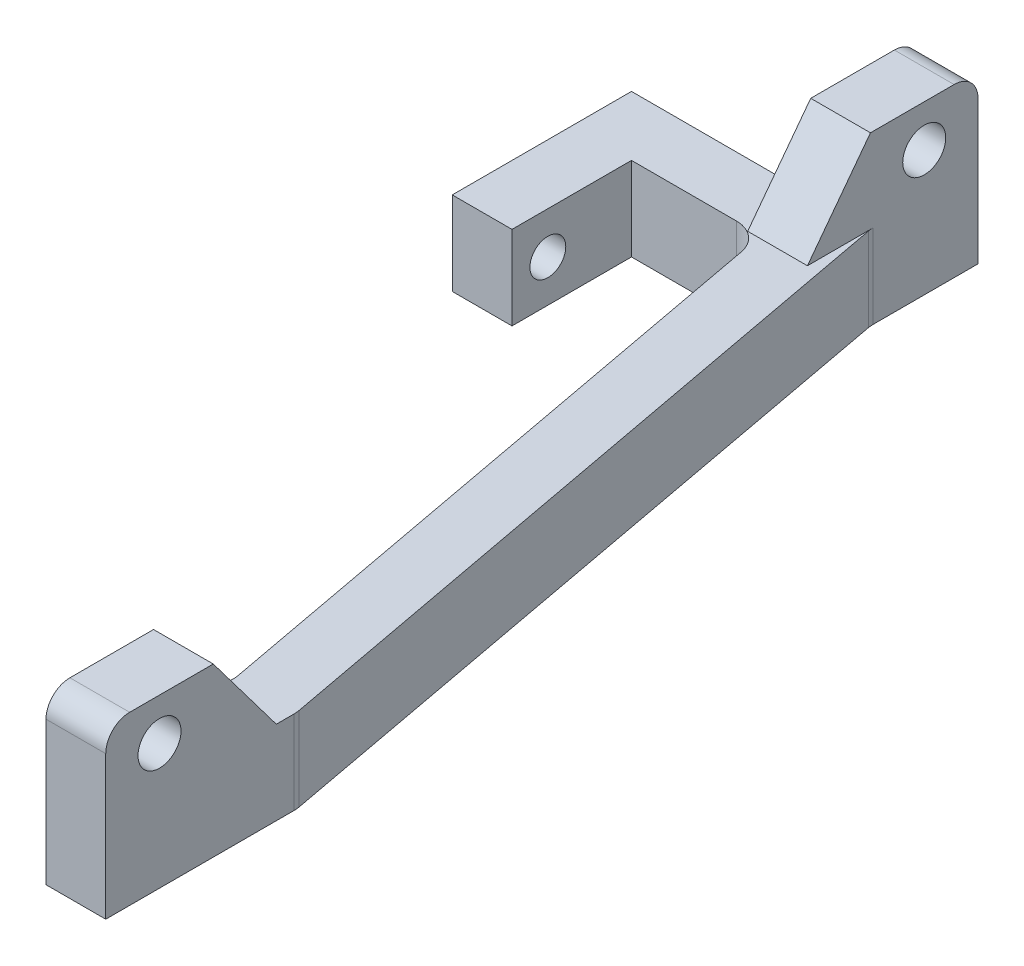
ISO-10303-21;
HEADER;
FILE_DESCRIPTION(('STEP AP214'),'2;1');
FILE_NAME('part.step','',(''),(''),'','','');
FILE_SCHEMA(('AUTOMOTIVE_DESIGN { 1 0 10303 214 1 1 1 1 }'));
ENDSEC;
DATA;
#1=APPLICATION_CONTEXT('core data for automotive mechanical design processes');
#2=APPLICATION_PROTOCOL_DEFINITION('international standard','automotive_design',2000,#1);
#3=PRODUCT_CONTEXT('',#1,'mechanical');
#4=PRODUCT('Part','Part','',(#3));
#5=PRODUCT_RELATED_PRODUCT_CATEGORY('part','',(#4));
#6=PRODUCT_DEFINITION_FORMATION('','',#4);
#7=PRODUCT_DEFINITION_CONTEXT('part definition',#1,'design');
#8=PRODUCT_DEFINITION('design','',#6,#7);
#9=PRODUCT_DEFINITION_SHAPE('','',#8);
#10=(LENGTH_UNIT() NAMED_UNIT(*) SI_UNIT(.MILLI.,.METRE.));
#11=(NAMED_UNIT(*) PLANE_ANGLE_UNIT() SI_UNIT($,.RADIAN.));
#12=(NAMED_UNIT(*) SI_UNIT($,.STERADIAN.) SOLID_ANGLE_UNIT());
#13=UNCERTAINTY_MEASURE_WITH_UNIT(LENGTH_MEASURE(1.E-05),#10,'distance_accuracy_value','');
#14=(GEOMETRIC_REPRESENTATION_CONTEXT(3) GLOBAL_UNCERTAINTY_ASSIGNED_CONTEXT((#13)) GLOBAL_UNIT_ASSIGNED_CONTEXT((#10,
#11,#12)) REPRESENTATION_CONTEXT('',''));
#15=CARTESIAN_POINT('',(0.,0.,0.));
#16=DIRECTION('',(0.,0.,1.));
#17=DIRECTION('',(1.,0.,0.));
#18=AXIS2_PLACEMENT_3D('',#15,#16,#17);
#19=CARTESIAN_POINT('',(0.,7.,0.));
#20=DIRECTION('',(0.,1.,0.));
#21=DIRECTION('',(0.,0.,1.));
#22=AXIS2_PLACEMENT_3D('',#19,#20,#21);
#23=PLANE('',#22);
#24=DIRECTION('',(0.,0.,-1.));
#25=VECTOR('',#24,1.);
#26=CARTESIAN_POINT('',(23.4138420040259,7.,0.));
#27=LINE('',#26,#25);
#28=CARTESIAN_POINT('',(23.4138420040259,7.,-5.27487835071954));
#29=VERTEX_POINT('',#28);
#30=CARTESIAN_POINT('',(23.4138420040259,7.,-6.76893991988756));
#31=VERTEX_POINT('',#30);
#32=EDGE_CURVE('E399',#29,#31,#27,.T.);
#33=ORIENTED_EDGE('',*,*,#32,.F.);
#34=DIRECTION('',(1.,0.,0.));
#35=VECTOR('',#34,1.);
#36=CARTESIAN_POINT('',(0.,7.,-5.27487835071958));
#37=LINE('',#36,#35);
#38=CARTESIAN_POINT('',(28.5,7.,-5.27487835071953));
#39=VERTEX_POINT('',#38);
#40=EDGE_CURVE('E362',#29,#39,#37,.T.);
#41=ORIENTED_EDGE('',*,*,#40,.T.);
#42=DIRECTION('',(0.,0.,-1.));
#43=VECTOR('',#42,1.);
#44=CARTESIAN_POINT('',(28.5,7.,0.));
#45=LINE('',#44,#43);
#46=CARTESIAN_POINT('',(28.5,7.,-6.76893991988754));
#47=VERTEX_POINT('',#46);
#48=EDGE_CURVE('E241',#39,#47,#45,.T.);
#49=ORIENTED_EDGE('',*,*,#48,.T.);
#50=CARTESIAN_POINT('',(26.,7.,-6.76893991988754));
#51=DIRECTION('',(0.,1.,0.));
#52=DIRECTION('',(0.,0.,1.));
#53=AXIS2_PLACEMENT_3D('',#50,#51,#52);
#54=CIRCLE('',#53,2.5);
#55=CARTESIAN_POINT('',(28.4576507473606,7.,-7.22714599142935));
#56=VERTEX_POINT('',#55);
#57=EDGE_CURVE('E308',#47,#56,#54,.T.);
#58=ORIENTED_EDGE('',*,*,#57,.T.);
#59=DIRECTION('',(-0.183282428616724,0.,-0.983060298944249));
#60=VECTOR('',#59,1.);
#61=CARTESIAN_POINT('',(28.8038589672404,7.,-5.37021099389228));
#62=LINE('',#61,#60);
#63=CARTESIAN_POINT('',(17.5423492526394,7.,-65.7728540085706));
#64=VERTEX_POINT('',#63);
#65=EDGE_CURVE('E236',#56,#64,#62,.T.);
#66=ORIENTED_EDGE('',*,*,#65,.T.);
#67=CARTESIAN_POINT('',(20.,7.,-66.2310600801124));
#68=DIRECTION('',(0.,1.,0.));
#69=DIRECTION('',(0.,0.,1.));
#70=AXIS2_PLACEMENT_3D('',#67,#68,#69);
#71=CIRCLE('',#70,2.5);
#72=CARTESIAN_POINT('',(17.5,7.,-66.2310600801124));
#73=VERTEX_POINT('',#72);
#74=EDGE_CURVE('E326',#64,#73,#71,.F.);
#75=ORIENTED_EDGE('',*,*,#74,.T.);
#76=DIRECTION('',(0.,0.,-1.));
#77=VECTOR('',#76,1.);
#78=CARTESIAN_POINT('',(17.5,7.,0.));
#79=LINE('',#78,#77);
#80=CARTESIAN_POINT('',(17.5,7.,-60.7251216492804));
#81=VERTEX_POINT('',#80);
#82=EDGE_CURVE('E290',#81,#73,#79,.T.);
#83=ORIENTED_EDGE('',*,*,#82,.F.);
#84=DIRECTION('',(-1.,0.,0.));
#85=VECTOR('',#84,1.);
#86=CARTESIAN_POINT('',(12.5,7.,-60.7251216492804));
#87=LINE('',#86,#85);
#88=CARTESIAN_POINT('',(12.5,7.,-60.7251216492804));
#89=VERTEX_POINT('',#88);
#90=EDGE_CURVE('E359',#81,#89,#87,.T.);
#91=ORIENTED_EDGE('',*,*,#90,.T.);
#92=DIRECTION('',(0.,0.,-1.));
#93=VECTOR('',#92,1.);
#94=CARTESIAN_POINT('',(12.5000000000001,7.,0.));
#95=LINE('',#94,#93);
#96=CARTESIAN_POINT('',(12.5,7.,-66.));
#97=VERTEX_POINT('',#96);
#98=EDGE_CURVE('E234',#89,#97,#95,.T.);
#99=ORIENTED_EDGE('',*,*,#98,.T.);
#100=DIRECTION('',(1.,0.,0.));
#101=VECTOR('',#100,1.);
#102=CARTESIAN_POINT('',(1.83186799063151E-13,7.,-66.));
#103=LINE('',#102,#101);
#104=CARTESIAN_POINT('',(-2.5,7.,-66.));
#105=VERTEX_POINT('',#104);
#106=EDGE_CURVE('E226',#105,#97,#103,.T.);
#107=ORIENTED_EDGE('',*,*,#106,.F.);
#108=DIRECTION('',(0.,0.,-1.));
#109=VECTOR('',#108,1.);
#110=CARTESIAN_POINT('',(-2.5,7.,-51.));
#111=LINE('',#110,#109);
#112=CARTESIAN_POINT('',(-2.5,7.,-51.));
#113=VERTEX_POINT('',#112);
#114=EDGE_CURVE('E208',#113,#105,#111,.T.);
#115=ORIENTED_EDGE('',*,*,#114,.F.);
#116=DIRECTION('',(-1.,0.,0.));
#117=VECTOR('',#116,1.);
#118=CARTESIAN_POINT('',(-2.5,7.,-51.));
#119=LINE('',#118,#117);
#120=CARTESIAN_POINT('',(2.5,7.,-51.));
#121=VERTEX_POINT('',#120);
#122=EDGE_CURVE('E220',#121,#113,#119,.T.);
#123=ORIENTED_EDGE('',*,*,#122,.F.);
#124=DIRECTION('',(0.,0.,-1.));
#125=VECTOR('',#124,1.);
#126=CARTESIAN_POINT('',(2.5,7.,-51.));
#127=LINE('',#126,#125);
#128=CARTESIAN_POINT('',(2.5,7.,-61.));
#129=VERTEX_POINT('',#128);
#130=EDGE_CURVE('E219',#121,#129,#127,.T.);
#131=ORIENTED_EDGE('',*,*,#130,.T.);
#132=DIRECTION('',(-1.,0.,0.));
#133=VECTOR('',#132,1.);
#134=CARTESIAN_POINT('',(0.,7.,-61.));
#135=LINE('',#134,#133);
#136=CARTESIAN_POINT('',(11.2690680907846,7.,-61.));
#137=VERTEX_POINT('',#136);
#138=EDGE_CURVE('E279',#137,#129,#135,.T.);
#139=ORIENTED_EDGE('',*,*,#138,.F.);
#140=CARTESIAN_POINT('',(11.2690680907846,7.,-58.5));
#141=DIRECTION('',(0.,1.,0.));
#142=DIRECTION('',(0.,0.,1.));
#143=AXIS2_PLACEMENT_3D('',#140,#141,#142);
#144=CIRCLE('',#143,2.5);
#145=CARTESIAN_POINT('',(13.7267188381452,7.,-58.9582060715418));
#146=VERTEX_POINT('',#145);
#147=EDGE_CURVE('E330',#137,#146,#144,.F.);
#148=ORIENTED_EDGE('',*,*,#147,.T.);
#149=DIRECTION('',(-0.183282428616724,0.,-0.983060298944249));
#150=VECTOR('',#149,1.);
#151=CARTESIAN_POINT('',(23.8885574725192,7.,-4.45379885080866));
#152=LINE('',#151,#150);
#153=CARTESIAN_POINT('',(23.3714927513865,7.,-7.22714599142936));
#154=VERTEX_POINT('',#153);
#155=EDGE_CURVE('E396',#154,#146,#152,.T.);
#156=ORIENTED_EDGE('',*,*,#155,.F.);
#157=CARTESIAN_POINT('',(20.9138420040259,7.,-6.76893991988755));
#158=DIRECTION('',(0.,1.,0.));
#159=DIRECTION('',(0.,0.,1.));
#160=AXIS2_PLACEMENT_3D('',#157,#158,#159);
#161=CIRCLE('',#160,2.5);
#162=EDGE_CURVE('E334',#154,#31,#161,.F.);
#163=ORIENTED_EDGE('',*,*,#162,.T.);
#164=EDGE_LOOP('',(#33,#41,#49,#58,#66,#75,#83,#91,#99,#107,#115,#123,#131,#139,#148,#156,#163));
#165=FACE_BOUND('',#164,.T.);
#166=ADVANCED_FACE('F40',(#165),#23,.T.);
#167=CARTESIAN_POINT('',(1.83186799063151E-13,7.,-66.));
#168=DIRECTION('',(0.,0.,-1.));
#169=DIRECTION('',(-1.,0.,0.));
#170=AXIS2_PLACEMENT_3D('',#167,#168,#169);
#171=PLANE('',#170);
#172=DIRECTION('',(1.,0.,0.));
#173=VECTOR('',#172,1.);
#174=CARTESIAN_POINT('',(1.83186799063151E-13,0.,-66.));
#175=LINE('',#174,#173);
#176=CARTESIAN_POINT('',(-2.5,0.,-66.));
#177=VERTEX_POINT('',#176);
#178=CARTESIAN_POINT('',(12.5,0.,-66.));
#179=VERTEX_POINT('',#178);
#180=EDGE_CURVE('E228',#177,#179,#175,.T.);
#181=ORIENTED_EDGE('',*,*,#180,.F.);
#182=DIRECTION('',(0.,1.,0.));
#183=VECTOR('',#182,1.);
#184=CARTESIAN_POINT('',(-2.5,7.,-66.));
#185=LINE('',#184,#183);
#186=EDGE_CURVE('E212',#177,#105,#185,.T.);
#187=ORIENTED_EDGE('',*,*,#186,.T.);
#188=ORIENTED_EDGE('',*,*,#106,.T.);
#189=DIRECTION('',(0.,-1.,0.));
#190=VECTOR('',#189,1.);
#191=CARTESIAN_POINT('',(12.5,7.,-66.));
#192=LINE('',#191,#190);
#193=EDGE_CURVE('E235',#97,#179,#192,.T.);
#194=ORIENTED_EDGE('',*,*,#193,.T.);
#195=EDGE_LOOP('',(#181,#187,#188,#194));
#196=FACE_BOUND('',#195,.T.);
#197=ADVANCED_FACE('F224',(#196),#171,.T.);
#198=CARTESIAN_POINT('',(0.,0.,0.));
#199=DIRECTION('',(0.,1.,0.));
#200=DIRECTION('',(0.,0.,1.));
#201=AXIS2_PLACEMENT_3D('',#198,#199,#200);
#202=PLANE('',#201);
#203=DIRECTION('',(0.,0.,-1.));
#204=VECTOR('',#203,1.);
#205=CARTESIAN_POINT('',(-2.5,0.,-51.));
#206=LINE('',#205,#204);
#207=CARTESIAN_POINT('',(-2.5,0.,-51.));
#208=VERTEX_POINT('',#207);
#209=EDGE_CURVE('E435',#208,#177,#206,.T.);
#210=ORIENTED_EDGE('',*,*,#209,.T.);
#211=ORIENTED_EDGE('',*,*,#180,.T.);
#212=DIRECTION('',(0.,0.,1.));
#213=VECTOR('',#212,1.);
#214=CARTESIAN_POINT('',(12.5000000000001,0.,0.));
#215=LINE('',#214,#213);
#216=CARTESIAN_POINT('',(12.5,0.,-75.));
#217=VERTEX_POINT('',#216);
#218=EDGE_CURVE('E276',#217,#179,#215,.T.);
#219=ORIENTED_EDGE('',*,*,#218,.F.);
#220=DIRECTION('',(-1.,0.,0.));
#221=VECTOR('',#220,1.);
#222=CARTESIAN_POINT('',(4.16333634234433E-13,0.,-75.0000000000001));
#223=LINE('',#222,#221);
#224=CARTESIAN_POINT('',(17.5,0.,-75.));
#225=VERTEX_POINT('',#224);
#226=EDGE_CURVE('E273',#225,#217,#223,.T.);
#227=ORIENTED_EDGE('',*,*,#226,.F.);
#228=DIRECTION('',(0.,0.,-1.));
#229=VECTOR('',#228,1.);
#230=CARTESIAN_POINT('',(17.5,0.,0.));
#231=LINE('',#230,#229);
#232=CARTESIAN_POINT('',(17.5,0.,-66.2310600801124));
#233=VERTEX_POINT('',#232);
#234=EDGE_CURVE('E270',#233,#225,#231,.T.);
#235=ORIENTED_EDGE('',*,*,#234,.F.);
#236=CARTESIAN_POINT('',(20.,0.,-66.2310600801124));
#237=DIRECTION('',(0.,1.,0.));
#238=DIRECTION('',(0.,0.,1.));
#239=AXIS2_PLACEMENT_3D('',#236,#237,#238);
#240=CIRCLE('',#239,2.5);
#241=CARTESIAN_POINT('',(17.5423492526394,0.,-65.7728540085706));
#242=VERTEX_POINT('',#241);
#243=EDGE_CURVE('E324',#233,#242,#240,.T.);
#244=ORIENTED_EDGE('',*,*,#243,.T.);
#245=DIRECTION('',(-0.183282428616724,0.,-0.983060298944249));
#246=VECTOR('',#245,1.);
#247=CARTESIAN_POINT('',(28.8038589672404,0.,-5.37021099389228));
#248=LINE('',#247,#246);
#249=CARTESIAN_POINT('',(28.4576507473606,0.,-7.22714599142935));
#250=VERTEX_POINT('',#249);
#251=EDGE_CURVE('E267',#250,#242,#248,.T.);
#252=ORIENTED_EDGE('',*,*,#251,.F.);
#253=CARTESIAN_POINT('',(26.,0.,-6.76893991988754));
#254=DIRECTION('',(0.,1.,0.));
#255=DIRECTION('',(0.,0.,1.));
#256=AXIS2_PLACEMENT_3D('',#253,#254,#255);
#257=CIRCLE('',#256,2.5);
#258=CARTESIAN_POINT('',(28.5,0.,-6.76893991988754));
#259=VERTEX_POINT('',#258);
#260=EDGE_CURVE('E303',#250,#259,#257,.F.);
#261=ORIENTED_EDGE('',*,*,#260,.T.);
#262=DIRECTION('',(0.,0.,-1.));
#263=VECTOR('',#262,1.);
#264=CARTESIAN_POINT('',(28.5,0.,0.));
#265=LINE('',#264,#263);
#266=CARTESIAN_POINT('',(28.5,0.,9.));
#267=VERTEX_POINT('',#266);
#268=EDGE_CURVE('E264',#267,#259,#265,.T.);
#269=ORIENTED_EDGE('',*,*,#268,.F.);
#270=DIRECTION('',(1.,0.,0.));
#271=VECTOR('',#270,1.);
#272=CARTESIAN_POINT('',(0.,0.,8.99999999999999));
#273=LINE('',#272,#271);
#274=CARTESIAN_POINT('',(23.5,0.,9.));
#275=VERTEX_POINT('',#274);
#276=EDGE_CURVE('E261',#275,#267,#273,.T.);
#277=ORIENTED_EDGE('',*,*,#276,.F.);
#278=DIRECTION('',(0.,0.,1.));
#279=VECTOR('',#278,1.);
#280=CARTESIAN_POINT('',(23.5,0.,0.));
#281=LINE('',#280,#279);
#282=CARTESIAN_POINT('',(23.5,0.,0.));
#283=VERTEX_POINT('',#282);
#284=EDGE_CURVE('E258',#283,#275,#281,.T.);
#285=ORIENTED_EDGE('',*,*,#284,.F.);
#286=DIRECTION('',(-0.0172290414921646,0.,-0.999851569048757));
#287=VECTOR('',#286,1.);
#288=CARTESIAN_POINT('',(23.4930242630376,0.,-0.404822377974953));
#289=LINE('',#288,#287);
#290=CARTESIAN_POINT('',(23.414213081404,0.,-4.97846529658016));
#291=VERTEX_POINT('',#290);
#292=EDGE_CURVE('E255',#283,#291,#289,.T.);
#293=ORIENTED_EDGE('',*,*,#292,.T.);
#294=CARTESIAN_POINT('',(25.9138420040259,0.,-5.02153790031057));
#295=DIRECTION('',(0.,1.,0.));
#296=DIRECTION('',(0.,0.,1.));
#297=AXIS2_PLACEMENT_3D('',#294,#295,#296);
#298=CIRCLE('',#297,2.5);
#299=CARTESIAN_POINT('',(23.4138420040259,0.,-5.02153790031057));
#300=VERTEX_POINT('',#299);
#301=EDGE_CURVE('E301',#291,#300,#298,.F.);
#302=ORIENTED_EDGE('',*,*,#301,.T.);
#303=DIRECTION('',(0.,0.,-1.));
#304=VECTOR('',#303,1.);
#305=CARTESIAN_POINT('',(23.4138420040259,0.,0.));
#306=LINE('',#305,#304);
#307=CARTESIAN_POINT('',(23.4138420040259,0.,-6.76893991988756));
#308=VERTEX_POINT('',#307);
#309=EDGE_CURVE('E252',#300,#308,#306,.T.);
#310=ORIENTED_EDGE('',*,*,#309,.T.);
#311=CARTESIAN_POINT('',(20.9138420040259,0.,-6.76893991988755));
#312=DIRECTION('',(0.,1.,0.));
#313=DIRECTION('',(0.,0.,1.));
#314=AXIS2_PLACEMENT_3D('',#311,#312,#313);
#315=CIRCLE('',#314,2.5);
#316=CARTESIAN_POINT('',(23.3714927513865,0.,-7.22714599142936));
#317=VERTEX_POINT('',#316);
#318=EDGE_CURVE('E332',#308,#317,#315,.T.);
#319=ORIENTED_EDGE('',*,*,#318,.T.);
#320=DIRECTION('',(-0.183282428616724,0.,-0.983060298944249));
#321=VECTOR('',#320,1.);
#322=CARTESIAN_POINT('',(23.8885574725192,0.,-4.45379885080866));
#323=LINE('',#322,#321);
#324=CARTESIAN_POINT('',(13.7267188381452,0.,-58.9582060715418));
#325=VERTEX_POINT('',#324);
#326=EDGE_CURVE('E248',#317,#325,#323,.T.);
#327=ORIENTED_EDGE('',*,*,#326,.T.);
#328=CARTESIAN_POINT('',(11.2690680907846,0.,-58.5));
#329=DIRECTION('',(0.,1.,0.));
#330=DIRECTION('',(0.,0.,1.));
#331=AXIS2_PLACEMENT_3D('',#328,#329,#330);
#332=CIRCLE('',#331,2.5);
#333=CARTESIAN_POINT('',(11.2690680907846,0.,-61.));
#334=VERTEX_POINT('',#333);
#335=EDGE_CURVE('E328',#325,#334,#332,.T.);
#336=ORIENTED_EDGE('',*,*,#335,.T.);
#337=DIRECTION('',(-1.,0.,0.));
#338=VECTOR('',#337,1.);
#339=CARTESIAN_POINT('',(0.,0.,-61.));
#340=LINE('',#339,#338);
#341=CARTESIAN_POINT('',(2.5,0.,-61.));
#342=VERTEX_POINT('',#341);
#343=EDGE_CURVE('E245',#334,#342,#340,.T.);
#344=ORIENTED_EDGE('',*,*,#343,.T.);
#345=DIRECTION('',(0.,0.,-1.));
#346=VECTOR('',#345,1.);
#347=CARTESIAN_POINT('',(2.5,0.,-51.));
#348=LINE('',#347,#346);
#349=CARTESIAN_POINT('',(2.5,0.,-51.));
#350=VERTEX_POINT('',#349);
#351=EDGE_CURVE('E439',#350,#342,#348,.T.);
#352=ORIENTED_EDGE('',*,*,#351,.F.);
#353=DIRECTION('',(1.,0.,0.));
#354=VECTOR('',#353,1.);
#355=CARTESIAN_POINT('',(-2.5,0.,-51.));
#356=LINE('',#355,#354);
#357=EDGE_CURVE('E437',#208,#350,#356,.T.);
#358=ORIENTED_EDGE('',*,*,#357,.F.);
#359=EDGE_LOOP('',(#210,#211,#219,#227,#235,#244,#252,#261,#269,#277,#285,#293,#302,#310,#319,
#327,#336,#344,#352,#358));
#360=FACE_BOUND('',#359,.T.);
#361=ADVANCED_FACE('F418',(#360),#202,.F.);
#362=CARTESIAN_POINT('',(0.,7.,-61.));
#363=DIRECTION('',(0.,0.,1.));
#364=DIRECTION('',(1.,0.,0.));
#365=AXIS2_PLACEMENT_3D('',#362,#363,#364);
#366=PLANE('',#365);
#367=ORIENTED_EDGE('',*,*,#138,.T.);
#368=DIRECTION('',(0.,1.,0.));
#369=VECTOR('',#368,1.);
#370=CARTESIAN_POINT('',(2.5,7.,-61.));
#371=LINE('',#370,#369);
#372=EDGE_CURVE('E341',#342,#129,#371,.T.);
#373=ORIENTED_EDGE('',*,*,#372,.F.);
#374=ORIENTED_EDGE('',*,*,#343,.F.);
#375=DIRECTION('',(0.,-1.,0.));
#376=VECTOR('',#375,1.);
#377=CARTESIAN_POINT('',(11.2690680907846,7.,-61.));
#378=LINE('',#377,#376);
#379=EDGE_CURVE('E315',#334,#137,#378,.F.);
#380=ORIENTED_EDGE('',*,*,#379,.T.);
#381=EDGE_LOOP('',(#367,#373,#374,#380));
#382=FACE_BOUND('',#381,.T.);
#383=ADVANCED_FACE('F504',(#382),#366,.T.);
#384=CARTESIAN_POINT('',(23.8885574725192,7.,-4.45379885080866));
#385=DIRECTION('',(-0.983060298944249,0.,0.183282428616724));
#386=DIRECTION('',(0.183282428616724,0.,0.983060298944249));
#387=AXIS2_PLACEMENT_3D('',#384,#385,#386);
#388=PLANE('',#387);
#389=ORIENTED_EDGE('',*,*,#155,.T.);
#390=DIRECTION('',(0.,-1.,0.));
#391=VECTOR('',#390,1.);
#392=CARTESIAN_POINT('',(13.7267188381452,0.,-58.9582060715418));
#393=LINE('',#392,#391);
#394=EDGE_CURVE('E312',#146,#325,#393,.T.);
#395=ORIENTED_EDGE('',*,*,#394,.T.);
#396=ORIENTED_EDGE('',*,*,#326,.F.);
#397=DIRECTION('',(0.,-1.,0.));
#398=VECTOR('',#397,1.);
#399=CARTESIAN_POINT('',(23.3714927513865,7.,-7.22714599142936));
#400=LINE('',#399,#398);
#401=EDGE_CURVE('E310',#317,#154,#400,.F.);
#402=ORIENTED_EDGE('',*,*,#401,.T.);
#403=EDGE_LOOP('',(#389,#395,#396,#402));
#404=FACE_BOUND('',#403,.T.);
#405=ADVANCED_FACE('F494',(#404),#388,.T.);
#406=CARTESIAN_POINT('',(23.4138420040259,7.,0.));
#407=DIRECTION('',(-1.,0.,0.));
#408=DIRECTION('',(0.,0.,1.));
#409=AXIS2_PLACEMENT_3D('',#406,#407,#408);
#410=PLANE('',#409);
#411=DIRECTION('',(0.,-1.,0.));
#412=VECTOR('',#411,1.);
#413=CARTESIAN_POINT('',(23.4138420040259,7.,-5.02153790031057));
#414=LINE('',#413,#412);
#415=CARTESIAN_POINT('',(23.4138420040259,7.33619413282221,-5.02153790031057));
#416=VERTEX_POINT('',#415);
#417=EDGE_CURVE('E57',#300,#416,#414,.F.);
#418=ORIENTED_EDGE('',*,*,#417,.T.);
#419=DIRECTION('',(0.,-0.798635510047292,-0.60181502315205));
#420=VECTOR('',#419,1.);
#421=CARTESIAN_POINT('',(23.4138420040259,14.,0.));
#422=LINE('',#421,#420);
#423=EDGE_CURVE('E369',#416,#29,#422,.T.);
#424=ORIENTED_EDGE('',*,*,#423,.T.);
#425=ORIENTED_EDGE('',*,*,#32,.T.);
#426=DIRECTION('',(0.,-1.,0.));
#427=VECTOR('',#426,1.);
#428=CARTESIAN_POINT('',(23.4138420040259,0.,-6.76893991988756));
#429=LINE('',#428,#427);
#430=EDGE_CURVE('E318',#31,#308,#429,.T.);
#431=ORIENTED_EDGE('',*,*,#430,.T.);
#432=ORIENTED_EDGE('',*,*,#309,.F.);
#433=EDGE_LOOP('',(#418,#424,#425,#431,#432));
#434=FACE_BOUND('',#433,.T.);
#435=ADVANCED_FACE('F486',(#434),#410,.T.);
#436=CARTESIAN_POINT('',(23.4930242630376,7.,-0.404822377974953));
#437=DIRECTION('',(-0.999851569048757,0.,0.0172290414921646));
#438=DIRECTION('',(0.0172290414921646,0.,0.999851569048757));
#439=AXIS2_PLACEMENT_3D('',#436,#437,#438);
#440=PLANE('',#439);
#441=DIRECTION('',(0.,-1.,0.));
#442=VECTOR('',#441,1.);
#443=CARTESIAN_POINT('',(23.5,7.,0.));
#444=LINE('',#443,#442);
#445=CARTESIAN_POINT('',(23.5,14.,0.));
#446=VERTEX_POINT('',#445);
#447=EDGE_CURVE('E288',#446,#283,#444,.T.);
#448=ORIENTED_EDGE('',*,*,#447,.F.);
#449=DIRECTION('',(-0.0103696776965741,-0.798592570168664,-0.601782665632599));
#450=VECTOR('',#449,1.);
#451=CARTESIAN_POINT('',(23.497473039935,13.8053930322571,-0.146646868720862));
#452=LINE('',#451,#450);
#453=CARTESIAN_POINT('',(23.414213081404,7.39335340855636,-4.97846529658016));
#454=VERTEX_POINT('',#453);
#455=EDGE_CURVE('E364',#446,#454,#452,.T.);
#456=ORIENTED_EDGE('',*,*,#455,.T.);
#457=DIRECTION('',(0.,-1.,0.));
#458=VECTOR('',#457,1.);
#459=CARTESIAN_POINT('',(23.414213081404,7.,-4.97846529658016));
#460=LINE('',#459,#458);
#461=EDGE_CURVE('E321',#454,#291,#460,.T.);
#462=ORIENTED_EDGE('',*,*,#461,.T.);
#463=ORIENTED_EDGE('',*,*,#292,.F.);
#464=EDGE_LOOP('',(#448,#456,#462,#463));
#465=FACE_BOUND('',#464,.T.);
#466=ADVANCED_FACE('F480',(#465),#440,.T.);
#467=CARTESIAN_POINT('',(23.5,7.,0.));
#468=DIRECTION('',(1.,0.,0.));
#469=DIRECTION('',(0.,0.,-1.));
#470=AXIS2_PLACEMENT_3D('',#467,#468,#469);
#471=PLANE('',#470);
#472=CARTESIAN_POINT('',(23.5,10.5,4.50000000000003));
#473=DIRECTION('',(1.,0.,0.));
#474=DIRECTION('',(0.,0.,-1.));
#475=AXIS2_PLACEMENT_3D('',#472,#473,#474);
#476=CIRCLE('',#475,1.79999999999999);
#477=CARTESIAN_POINT('',(23.5,10.5,2.70000000000004));
#478=VERTEX_POINT('',#477);
#479=EDGE_CURVE('E442',#478,#478,#476,.T.);
#480=ORIENTED_EDGE('',*,*,#479,.T.);
#481=EDGE_LOOP('',(#480));
#482=FACE_BOUND('',#481,.T.);
#483=DIRECTION('',(0.,-1.,0.));
#484=VECTOR('',#483,1.);
#485=CARTESIAN_POINT('',(23.5,7.,9.));
#486=LINE('',#485,#484);
#487=CARTESIAN_POINT('',(23.5,12.,9.));
#488=VERTEX_POINT('',#487);
#489=EDGE_CURVE('E286',#488,#275,#486,.T.);
#490=ORIENTED_EDGE('',*,*,#489,.F.);
#491=CARTESIAN_POINT('',(23.5,12.,7.));
#492=DIRECTION('',(1.,0.,0.));
#493=DIRECTION('',(0.,0.,-1.));
#494=AXIS2_PLACEMENT_3D('',#491,#492,#493);
#495=CIRCLE('',#494,2.);
#496=CARTESIAN_POINT('',(23.5,14.,7.));
#497=VERTEX_POINT('',#496);
#498=EDGE_CURVE('E344',#488,#497,#495,.F.);
#499=ORIENTED_EDGE('',*,*,#498,.T.);
#500=DIRECTION('',(0.,0.,-1.));
#501=VECTOR('',#500,1.);
#502=CARTESIAN_POINT('',(23.5,14.,0.));
#503=LINE('',#502,#501);
#504=EDGE_CURVE('E455',#497,#446,#503,.T.);
#505=ORIENTED_EDGE('',*,*,#504,.T.);
#506=ORIENTED_EDGE('',*,*,#447,.T.);
#507=ORIENTED_EDGE('',*,*,#284,.T.);
#508=EDGE_LOOP('',(#490,#499,#505,#506,#507));
#509=FACE_BOUND('',#508,.T.);
#510=ADVANCED_FACE('F473',(#482,#509),#471,.F.);
#511=CARTESIAN_POINT('',(0.,7.,8.99999999999999));
#512=DIRECTION('',(0.,0.,-1.));
#513=DIRECTION('',(-1.,0.,0.));
#514=AXIS2_PLACEMENT_3D('',#511,#512,#513);
#515=PLANE('',#514);
#516=DIRECTION('',(0.,-1.,0.));
#517=VECTOR('',#516,1.);
#518=CARTESIAN_POINT('',(28.5,7.,9.));
#519=LINE('',#518,#517);
#520=CARTESIAN_POINT('',(28.5,12.,9.));
#521=VERTEX_POINT('',#520);
#522=EDGE_CURVE('E284',#521,#267,#519,.T.);
#523=ORIENTED_EDGE('',*,*,#522,.F.);
#524=DIRECTION('',(-1.,0.,0.));
#525=VECTOR('',#524,1.);
#526=CARTESIAN_POINT('',(23.5,12.,9.));
#527=LINE('',#526,#525);
#528=EDGE_CURVE('E337',#521,#488,#527,.T.);
#529=ORIENTED_EDGE('',*,*,#528,.T.);
#530=ORIENTED_EDGE('',*,*,#489,.T.);
#531=ORIENTED_EDGE('',*,*,#276,.T.);
#532=EDGE_LOOP('',(#523,#529,#530,#531));
#533=FACE_BOUND('',#532,.T.);
#534=ADVANCED_FACE('F471',(#533),#515,.F.);
#535=CARTESIAN_POINT('',(28.5,7.,0.));
#536=DIRECTION('',(-1.,0.,0.));
#537=DIRECTION('',(0.,0.,1.));
#538=AXIS2_PLACEMENT_3D('',#535,#536,#537);
#539=PLANE('',#538);
#540=CARTESIAN_POINT('',(28.5,10.5,4.50000000000003));
#541=DIRECTION('',(1.,0.,0.));
#542=DIRECTION('',(0.,0.,-1.));
#543=AXIS2_PLACEMENT_3D('',#540,#541,#542);
#544=CIRCLE('',#543,1.79999999999999);
#545=CARTESIAN_POINT('',(28.5,10.5,2.70000000000004));
#546=VERTEX_POINT('',#545);
#547=EDGE_CURVE('E438',#546,#546,#544,.T.);
#548=ORIENTED_EDGE('',*,*,#547,.F.);
#549=EDGE_LOOP('',(#548));
#550=FACE_BOUND('',#549,.T.);
#551=DIRECTION('',(0.,0.,1.));
#552=VECTOR('',#551,1.);
#553=CARTESIAN_POINT('',(28.5,14.,0.));
#554=LINE('',#553,#552);
#555=CARTESIAN_POINT('',(28.5,14.,0.));
#556=VERTEX_POINT('',#555);
#557=CARTESIAN_POINT('',(28.5,14.,7.));
#558=VERTEX_POINT('',#557);
#559=EDGE_CURVE('E390',#556,#558,#554,.T.);
#560=ORIENTED_EDGE('',*,*,#559,.T.);
#561=CARTESIAN_POINT('',(28.5,12.,7.));
#562=DIRECTION('',(-1.,0.,0.));
#563=DIRECTION('',(0.,0.,1.));
#564=AXIS2_PLACEMENT_3D('',#561,#562,#563);
#565=CIRCLE('',#564,2.);
#566=EDGE_CURVE('E348',#558,#521,#565,.F.);
#567=ORIENTED_EDGE('',*,*,#566,.T.);
#568=ORIENTED_EDGE('',*,*,#522,.T.);
#569=ORIENTED_EDGE('',*,*,#268,.T.);
#570=DIRECTION('',(0.,-1.,0.));
#571=VECTOR('',#570,1.);
#572=CARTESIAN_POINT('',(28.5,7.,-6.76893991988754));
#573=LINE('',#572,#571);
#574=EDGE_CURVE('E305',#259,#47,#573,.F.);
#575=ORIENTED_EDGE('',*,*,#574,.T.);
#576=ORIENTED_EDGE('',*,*,#48,.F.);
#577=DIRECTION('',(0.,0.798635510047292,0.60181502315205));
#578=VECTOR('',#577,1.);
#579=CARTESIAN_POINT('',(28.5,9.53526925464049,-3.36441593578409));
#580=LINE('',#579,#578);
#581=EDGE_CURVE('E371',#39,#556,#580,.T.);
#582=ORIENTED_EDGE('',*,*,#581,.T.);
#583=EDGE_LOOP('',(#560,#567,#568,#569,#575,#576,#582));
#584=FACE_BOUND('',#583,.T.);
#585=ADVANCED_FACE('F408',(#550,#584),#539,.F.);
#586=CARTESIAN_POINT('',(28.8038589672404,7.,-5.37021099389228));
#587=DIRECTION('',(-0.983060298944249,0.,0.183282428616724));
#588=DIRECTION('',(0.183282428616724,0.,0.983060298944249));
#589=AXIS2_PLACEMENT_3D('',#586,#587,#588);
#590=PLANE('',#589);
#591=ORIENTED_EDGE('',*,*,#251,.T.);
#592=DIRECTION('',(0.,-1.,0.));
#593=VECTOR('',#592,1.);
#594=CARTESIAN_POINT('',(17.5423492526394,7.,-65.7728540085706));
#595=LINE('',#594,#593);
#596=EDGE_CURVE('E299',#242,#64,#595,.F.);
#597=ORIENTED_EDGE('',*,*,#596,.T.);
#598=ORIENTED_EDGE('',*,*,#65,.F.);
#599=DIRECTION('',(0.,-1.,0.));
#600=VECTOR('',#599,1.);
#601=CARTESIAN_POINT('',(28.4576507473606,7.,-7.22714599142935));
#602=LINE('',#601,#600);
#603=EDGE_CURVE('E296',#56,#250,#602,.T.);
#604=ORIENTED_EDGE('',*,*,#603,.T.);
#605=EDGE_LOOP('',(#591,#597,#598,#604));
#606=FACE_BOUND('',#605,.T.);
#607=ADVANCED_FACE('F415',(#606),#590,.F.);
#608=CARTESIAN_POINT('',(17.5,7.,0.));
#609=DIRECTION('',(-1.,0.,0.));
#610=DIRECTION('',(0.,0.,1.));
#611=AXIS2_PLACEMENT_3D('',#608,#609,#610);
#612=PLANE('',#611);
#613=CARTESIAN_POINT('',(17.5,10.5,-70.4999999999998));
#614=DIRECTION('',(-1.,0.,0.));
#615=DIRECTION('',(0.,0.,1.));
#616=AXIS2_PLACEMENT_3D('',#613,#614,#615);
#617=CIRCLE('',#616,1.79999999999999);
#618=CARTESIAN_POINT('',(17.5,10.5,-68.6999999999998));
#619=VERTEX_POINT('',#618);
#620=EDGE_CURVE('E449',#619,#619,#617,.T.);
#621=ORIENTED_EDGE('',*,*,#620,.T.);
#622=EDGE_LOOP('',(#621));
#623=FACE_BOUND('',#622,.T.);
#624=DIRECTION('',(0.,-1.,0.));
#625=VECTOR('',#624,1.);
#626=CARTESIAN_POINT('',(17.5,7.,-75.));
#627=LINE('',#626,#625);
#628=CARTESIAN_POINT('',(17.5,12.,-75.));
#629=VERTEX_POINT('',#628);
#630=EDGE_CURVE('E282',#629,#225,#627,.T.);
#631=ORIENTED_EDGE('',*,*,#630,.F.);
#632=CARTESIAN_POINT('',(17.5,12.,-73.));
#633=DIRECTION('',(-1.,0.,0.));
#634=DIRECTION('',(0.,0.,1.));
#635=AXIS2_PLACEMENT_3D('',#632,#633,#634);
#636=CIRCLE('',#635,2.);
#637=CARTESIAN_POINT('',(17.5,14.,-73.));
#638=VERTEX_POINT('',#637);
#639=EDGE_CURVE('E353',#629,#638,#636,.F.);
#640=ORIENTED_EDGE('',*,*,#639,.T.);
#641=DIRECTION('',(0.,0.,1.));
#642=VECTOR('',#641,1.);
#643=CARTESIAN_POINT('',(17.5,14.,0.));
#644=LINE('',#643,#642);
#645=CARTESIAN_POINT('',(17.5,14.,-66.));
#646=VERTEX_POINT('',#645);
#647=EDGE_CURVE('E388',#638,#646,#644,.T.);
#648=ORIENTED_EDGE('',*,*,#647,.T.);
#649=DIRECTION('',(0.,0.798635510047292,-0.601815023152049));
#650=VECTOR('',#649,1.);
#651=CARTESIAN_POINT('',(17.5,-22.186366711324,-38.7316168061768));
#652=LINE('',#651,#650);
#653=EDGE_CURVE('E11',#646,#81,#652,.F.);
#654=ORIENTED_EDGE('',*,*,#653,.T.);
#655=ORIENTED_EDGE('',*,*,#82,.T.);
#656=DIRECTION('',(0.,-1.,0.));
#657=VECTOR('',#656,1.);
#658=CARTESIAN_POINT('',(17.5,0.,-66.2310600801124));
#659=LINE('',#658,#657);
#660=EDGE_CURVE('E293',#73,#233,#659,.T.);
#661=ORIENTED_EDGE('',*,*,#660,.T.);
#662=ORIENTED_EDGE('',*,*,#234,.T.);
#663=EDGE_LOOP('',(#631,#640,#648,#654,#655,#661,#662));
#664=FACE_BOUND('',#663,.T.);
#665=ADVANCED_FACE('F427',(#623,#664),#612,.F.);
#666=CARTESIAN_POINT('',(4.16333634234433E-13,7.,-75.0000000000001));
#667=DIRECTION('',(0.,0.,1.));
#668=DIRECTION('',(1.,0.,0.));
#669=AXIS2_PLACEMENT_3D('',#666,#667,#668);
#670=PLANE('',#669);
#671=DIRECTION('',(0.,-1.,0.));
#672=VECTOR('',#671,1.);
#673=CARTESIAN_POINT('',(12.5,7.,-75.));
#674=LINE('',#673,#672);
#675=CARTESIAN_POINT('',(12.5,12.,-75.));
#676=VERTEX_POINT('',#675);
#677=EDGE_CURVE('E238',#676,#217,#674,.T.);
#678=ORIENTED_EDGE('',*,*,#677,.F.);
#679=DIRECTION('',(1.,0.,0.));
#680=VECTOR('',#679,1.);
#681=CARTESIAN_POINT('',(4.16333634234433E-13,12.,-75.0000000000001));
#682=LINE('',#681,#680);
#683=EDGE_CURVE('E350',#676,#629,#682,.T.);
#684=ORIENTED_EDGE('',*,*,#683,.T.);
#685=ORIENTED_EDGE('',*,*,#630,.T.);
#686=ORIENTED_EDGE('',*,*,#226,.T.);
#687=EDGE_LOOP('',(#678,#684,#685,#686));
#688=FACE_BOUND('',#687,.T.);
#689=ADVANCED_FACE('F433',(#688),#670,.F.);
#690=CARTESIAN_POINT('',(12.5000000000001,7.,0.));
#691=DIRECTION('',(1.,0.,0.));
#692=DIRECTION('',(0.,0.,-1.));
#693=AXIS2_PLACEMENT_3D('',#690,#691,#692);
#694=PLANE('',#693);
#695=CARTESIAN_POINT('',(12.5,10.5,-70.4999999999998));
#696=DIRECTION('',(1.,0.,0.));
#697=DIRECTION('',(0.,0.,-1.));
#698=AXIS2_PLACEMENT_3D('',#695,#696,#697);
#699=CIRCLE('',#698,1.79999999999999);
#700=CARTESIAN_POINT('',(12.5,10.5,-72.2999999999998));
#701=VERTEX_POINT('',#700);
#702=EDGE_CURVE('E452',#701,#701,#699,.T.);
#703=ORIENTED_EDGE('',*,*,#702,.T.);
#704=EDGE_LOOP('',(#703));
#705=FACE_BOUND('',#704,.T.);
#706=DIRECTION('',(0.,0.,-1.));
#707=VECTOR('',#706,1.);
#708=CARTESIAN_POINT('',(12.5000000000001,14.,0.));
#709=LINE('',#708,#707);
#710=CARTESIAN_POINT('',(12.5,14.,-66.));
#711=VERTEX_POINT('',#710);
#712=CARTESIAN_POINT('',(12.5,14.,-73.));
#713=VERTEX_POINT('',#712);
#714=EDGE_CURVE('E249',#711,#713,#709,.T.);
#715=ORIENTED_EDGE('',*,*,#714,.T.);
#716=CARTESIAN_POINT('',(12.5,12.,-73.));
#717=DIRECTION('',(1.,0.,0.));
#718=DIRECTION('',(0.,0.,-1.));
#719=AXIS2_PLACEMENT_3D('',#716,#717,#718);
#720=CIRCLE('',#719,2.);
#721=EDGE_CURVE('E357',#713,#676,#720,.F.);
#722=ORIENTED_EDGE('',*,*,#721,.T.);
#723=ORIENTED_EDGE('',*,*,#677,.T.);
#724=ORIENTED_EDGE('',*,*,#218,.T.);
#725=ORIENTED_EDGE('',*,*,#193,.F.);
#726=ORIENTED_EDGE('',*,*,#98,.F.);
#727=DIRECTION('',(0.,-0.798635510047292,0.601815023152049));
#728=VECTOR('',#727,1.);
#729=CARTESIAN_POINT('',(12.5,-22.186366711324,-38.7316168061768));
#730=LINE('',#729,#728);
#731=EDGE_CURVE('E50',#89,#711,#730,.F.);
#732=ORIENTED_EDGE('',*,*,#731,.T.);
#733=EDGE_LOOP('',(#715,#722,#723,#724,#725,#726,#732));
#734=FACE_BOUND('',#733,.T.);
#735=ADVANCED_FACE('F375',(#705,#734),#694,.F.);
#736=CARTESIAN_POINT('',(0.,14.,0.));
#737=DIRECTION('',(0.,-1.,0.));
#738=DIRECTION('',(0.,0.,-1.));
#739=AXIS2_PLACEMENT_3D('',#736,#737,#738);
#740=PLANE('',#739);
#741=ORIENTED_EDGE('',*,*,#647,.F.);
#742=DIRECTION('',(1.,0.,0.));
#743=VECTOR('',#742,1.);
#744=CARTESIAN_POINT('',(4.05231403988182E-13,14.,-73.0000000000001));
#745=LINE('',#744,#743);
#746=EDGE_CURVE('E355',#638,#713,#745,.F.);
#747=ORIENTED_EDGE('',*,*,#746,.T.);
#748=ORIENTED_EDGE('',*,*,#714,.F.);
#749=DIRECTION('',(-1.,0.,0.));
#750=VECTOR('',#749,1.);
#751=CARTESIAN_POINT('',(1.83186799063151E-13,14.,-66.));
#752=LINE('',#751,#750);
#753=EDGE_CURVE('E384',#646,#711,#752,.T.);
#754=ORIENTED_EDGE('',*,*,#753,.F.);
#755=EDGE_LOOP('',(#741,#747,#748,#754));
#756=FACE_BOUND('',#755,.T.);
#757=ADVANCED_FACE('F383',(#756),#740,.F.);
#758=CARTESIAN_POINT('',(0.,14.,0.));
#759=DIRECTION('',(0.,1.,0.));
#760=DIRECTION('',(0.,0.,1.));
#761=AXIS2_PLACEMENT_3D('',#758,#759,#760);
#762=PLANE('',#761);
#763=ORIENTED_EDGE('',*,*,#504,.F.);
#764=DIRECTION('',(-1.,0.,0.));
#765=VECTOR('',#764,1.);
#766=CARTESIAN_POINT('',(28.5,14.,7.));
#767=LINE('',#766,#765);
#768=EDGE_CURVE('E346',#497,#558,#767,.F.);
#769=ORIENTED_EDGE('',*,*,#768,.T.);
#770=ORIENTED_EDGE('',*,*,#559,.F.);
#771=DIRECTION('',(-1.,0.,0.));
#772=VECTOR('',#771,1.);
#773=CARTESIAN_POINT('',(0.,14.,0.));
#774=LINE('',#773,#772);
#775=EDGE_CURVE('E458',#556,#446,#774,.T.);
#776=ORIENTED_EDGE('',*,*,#775,.T.);
#777=EDGE_LOOP('',(#763,#769,#770,#776));
#778=FACE_BOUND('',#777,.T.);
#779=ADVANCED_FACE('F594',(#778),#762,.T.);
#780=CARTESIAN_POINT('',(28.5,10.5,-70.4999999999998));
#781=DIRECTION('',(1.,0.,0.));
#782=DIRECTION('',(0.,0.,-1.));
#783=AXIS2_PLACEMENT_3D('',#780,#781,#782);
#784=CYLINDRICAL_SURFACE('',#783,1.79999999999999);
#785=ORIENTED_EDGE('',*,*,#620,.F.);
#786=EDGE_LOOP('',(#785));
#787=FACE_BOUND('',#786,.T.);
#788=ORIENTED_EDGE('',*,*,#702,.F.);
#789=EDGE_LOOP('',(#788));
#790=FACE_BOUND('',#789,.T.);
#791=ADVANCED_FACE('F596',(#787,#790),#784,.F.);
#792=CARTESIAN_POINT('',(28.5,10.5,4.50000000000003));
#793=DIRECTION('',(1.,0.,0.));
#794=DIRECTION('',(0.,0.,-1.));
#795=AXIS2_PLACEMENT_3D('',#792,#793,#794);
#796=CYLINDRICAL_SURFACE('',#795,1.79999999999999);
#797=ORIENTED_EDGE('',*,*,#547,.T.);
#798=EDGE_LOOP('',(#797));
#799=FACE_BOUND('',#798,.T.);
#800=ORIENTED_EDGE('',*,*,#479,.F.);
#801=EDGE_LOOP('',(#800));
#802=FACE_BOUND('',#801,.T.);
#803=ADVANCED_FACE('F575',(#799,#802),#796,.F.);
#804=CARTESIAN_POINT('',(20.,7.,-66.2310600801124));
#805=DIRECTION('',(0.,1.,0.));
#806=DIRECTION('',(0.,0.,1.));
#807=AXIS2_PLACEMENT_3D('',#804,#805,#806);
#808=CYLINDRICAL_SURFACE('',#807,2.5);
#809=ORIENTED_EDGE('',*,*,#74,.F.);
#810=ORIENTED_EDGE('',*,*,#596,.F.);
#811=ORIENTED_EDGE('',*,*,#243,.F.);
#812=ORIENTED_EDGE('',*,*,#660,.F.);
#813=EDGE_LOOP('',(#809,#810,#811,#812));
#814=FACE_BOUND('',#813,.T.);
#815=ADVANCED_FACE('F424',(#814),#808,.F.);
#816=CARTESIAN_POINT('',(26.,7.,-6.76893991988754));
#817=DIRECTION('',(0.,-1.,0.));
#818=DIRECTION('',(0.,0.,-1.));
#819=AXIS2_PLACEMENT_3D('',#816,#817,#818);
#820=CYLINDRICAL_SURFACE('',#819,2.5);
#821=ORIENTED_EDGE('',*,*,#57,.F.);
#822=ORIENTED_EDGE('',*,*,#574,.F.);
#823=ORIENTED_EDGE('',*,*,#260,.F.);
#824=ORIENTED_EDGE('',*,*,#603,.F.);
#825=EDGE_LOOP('',(#821,#822,#823,#824));
#826=FACE_BOUND('',#825,.T.);
#827=ADVANCED_FACE('F412',(#826),#820,.T.);
#828=CARTESIAN_POINT('',(11.2690680907846,7.,-58.5));
#829=DIRECTION('',(0.,1.,0.));
#830=DIRECTION('',(0.,0.,1.));
#831=AXIS2_PLACEMENT_3D('',#828,#829,#830);
#832=CYLINDRICAL_SURFACE('',#831,2.5);
#833=ORIENTED_EDGE('',*,*,#147,.F.);
#834=ORIENTED_EDGE('',*,*,#379,.F.);
#835=ORIENTED_EDGE('',*,*,#335,.F.);
#836=ORIENTED_EDGE('',*,*,#394,.F.);
#837=EDGE_LOOP('',(#833,#834,#835,#836));
#838=FACE_BOUND('',#837,.T.);
#839=ADVANCED_FACE('F499',(#838),#832,.F.);
#840=CARTESIAN_POINT('',(20.9138420040259,7.,-6.76893991988755));
#841=DIRECTION('',(0.,1.,0.));
#842=DIRECTION('',(0.,0.,1.));
#843=AXIS2_PLACEMENT_3D('',#840,#841,#842);
#844=CYLINDRICAL_SURFACE('',#843,2.5);
#845=ORIENTED_EDGE('',*,*,#162,.F.);
#846=ORIENTED_EDGE('',*,*,#401,.F.);
#847=ORIENTED_EDGE('',*,*,#318,.F.);
#848=ORIENTED_EDGE('',*,*,#430,.F.);
#849=EDGE_LOOP('',(#845,#846,#847,#848));
#850=FACE_BOUND('',#849,.T.);
#851=ADVANCED_FACE('F490',(#850),#844,.F.);
#852=CARTESIAN_POINT('',(25.9138420040259,7.,-5.02153790031057));
#853=DIRECTION('',(0.,-1.,0.));
#854=DIRECTION('',(0.,0.,-1.));
#855=AXIS2_PLACEMENT_3D('',#852,#853,#854);
#856=CYLINDRICAL_SURFACE('',#855,2.5);
#857=ORIENTED_EDGE('',*,*,#461,.F.);
#858=CARTESIAN_POINT('',(25.9138420040259,7.3361941328222,-5.02153790031057));
#859=DIRECTION('',(0.,-0.60181502315205,0.798635510047292));
#860=DIRECTION('',(0.,-0.798635510047292,-0.60181502315205));
#861=AXIS2_PLACEMENT_3D('',#858,#859,#860);
#862=ELLIPSE('',#861,4.1541003528062,2.5);
#863=EDGE_CURVE('E367',#454,#416,#862,.T.);
#864=ORIENTED_EDGE('',*,*,#863,.T.);
#865=ORIENTED_EDGE('',*,*,#417,.F.);
#866=ORIENTED_EDGE('',*,*,#301,.F.);
#867=EDGE_LOOP('',(#857,#864,#865,#866));
#868=FACE_BOUND('',#867,.T.);
#869=ADVANCED_FACE('F484',(#868),#856,.T.);
#870=CARTESIAN_POINT('',(-2.5,7.,-51.));
#871=DIRECTION('',(1.,0.,0.));
#872=DIRECTION('',(0.,1.,0.));
#873=AXIS2_PLACEMENT_3D('',#870,#871,#872);
#874=PLANE('',#873);
#875=CARTESIAN_POINT('',(-2.5,3.5,-54.));
#876=DIRECTION('',(-1.,0.,0.));
#877=DIRECTION('',(0.,-1.,0.));
#878=AXIS2_PLACEMENT_3D('',#875,#876,#877);
#879=CIRCLE('',#878,1.5);
#880=CARTESIAN_POINT('',(-2.5,2.,-54.));
#881=VERTEX_POINT('',#880);
#882=EDGE_CURVE('E229',#881,#881,#879,.T.);
#883=ORIENTED_EDGE('',*,*,#882,.F.);
#884=EDGE_LOOP('',(#883));
#885=FACE_BOUND('',#884,.T.);
#886=ORIENTED_EDGE('',*,*,#114,.T.);
#887=ORIENTED_EDGE('',*,*,#186,.F.);
#888=ORIENTED_EDGE('',*,*,#209,.F.);
#889=DIRECTION('',(0.,-1.,0.));
#890=VECTOR('',#889,1.);
#891=CARTESIAN_POINT('',(-2.5,7.,-51.));
#892=LINE('',#891,#890);
#893=EDGE_CURVE('E215',#113,#208,#892,.T.);
#894=ORIENTED_EDGE('',*,*,#893,.F.);
#895=EDGE_LOOP('',(#886,#887,#888,#894));
#896=FACE_BOUND('',#895,.T.);
#897=ADVANCED_FACE('F210',(#885,#896),#874,.F.);
#898=CARTESIAN_POINT('',(2.5,7.,-51.));
#899=DIRECTION('',(-1.,0.,0.));
#900=DIRECTION('',(0.,-1.,0.));
#901=AXIS2_PLACEMENT_3D('',#898,#899,#900);
#902=PLANE('',#901);
#903=CARTESIAN_POINT('',(2.5,3.5,-54.));
#904=DIRECTION('',(-1.,0.,0.));
#905=DIRECTION('',(0.,-1.,0.));
#906=AXIS2_PLACEMENT_3D('',#903,#904,#905);
#907=CIRCLE('',#906,1.5);
#908=CARTESIAN_POINT('',(2.5,2.,-54.));
#909=VERTEX_POINT('',#908);
#910=EDGE_CURVE('E338',#909,#909,#907,.T.);
#911=ORIENTED_EDGE('',*,*,#910,.T.);
#912=EDGE_LOOP('',(#911));
#913=FACE_BOUND('',#912,.T.);
#914=ORIENTED_EDGE('',*,*,#372,.T.);
#915=ORIENTED_EDGE('',*,*,#130,.F.);
#916=DIRECTION('',(0.,1.,0.));
#917=VECTOR('',#916,1.);
#918=CARTESIAN_POINT('',(2.5,7.,-51.));
#919=LINE('',#918,#917);
#920=EDGE_CURVE('E515',#350,#121,#919,.T.);
#921=ORIENTED_EDGE('',*,*,#920,.F.);
#922=ORIENTED_EDGE('',*,*,#351,.T.);
#923=EDGE_LOOP('',(#914,#915,#921,#922));
#924=FACE_BOUND('',#923,.T.);
#925=ADVANCED_FACE('F514',(#913,#924),#902,.F.);
#926=CARTESIAN_POINT('',(0.,0.,-51.));
#927=DIRECTION('',(0.,0.,1.));
#928=DIRECTION('',(1.,0.,0.));
#929=AXIS2_PLACEMENT_3D('',#926,#927,#928);
#930=PLANE('',#929);
#931=ORIENTED_EDGE('',*,*,#893,.T.);
#932=ORIENTED_EDGE('',*,*,#357,.T.);
#933=ORIENTED_EDGE('',*,*,#920,.T.);
#934=ORIENTED_EDGE('',*,*,#122,.T.);
#935=EDGE_LOOP('',(#931,#932,#933,#934));
#936=FACE_BOUND('',#935,.T.);
#937=ADVANCED_FACE('F531',(#936),#930,.T.);
#938=CARTESIAN_POINT('',(7.5,3.5,-54.));
#939=DIRECTION('',(-1.,0.,0.));
#940=DIRECTION('',(0.,-1.,0.));
#941=AXIS2_PLACEMENT_3D('',#938,#939,#940);
#942=CYLINDRICAL_SURFACE('',#941,1.5);
#943=ORIENTED_EDGE('',*,*,#882,.T.);
#944=EDGE_LOOP('',(#943));
#945=FACE_BOUND('',#944,.T.);
#946=ORIENTED_EDGE('',*,*,#910,.F.);
#947=EDGE_LOOP('',(#946));
#948=FACE_BOUND('',#947,.T.);
#949=ADVANCED_FACE('F522',(#945,#948),#942,.F.);
#950=CARTESIAN_POINT('',(0.,12.,6.99999999999999));
#951=DIRECTION('',(1.,0.,0.));
#952=DIRECTION('',(0.,0.,-1.));
#953=AXIS2_PLACEMENT_3D('',#950,#951,#952);
#954=CYLINDRICAL_SURFACE('',#953,2.);
#955=ORIENTED_EDGE('',*,*,#566,.F.);
#956=ORIENTED_EDGE('',*,*,#768,.F.);
#957=ORIENTED_EDGE('',*,*,#498,.F.);
#958=ORIENTED_EDGE('',*,*,#528,.F.);
#959=EDGE_LOOP('',(#955,#956,#957,#958));
#960=FACE_BOUND('',#959,.T.);
#961=ADVANCED_FACE('F468',(#960),#954,.T.);
#962=CARTESIAN_POINT('',(4.05231403988181E-13,12.,-73.0000000000001));
#963=DIRECTION('',(1.,0.,0.));
#964=DIRECTION('',(0.,0.,-1.));
#965=AXIS2_PLACEMENT_3D('',#962,#963,#964);
#966=CYLINDRICAL_SURFACE('',#965,2.);
#967=ORIENTED_EDGE('',*,*,#721,.F.);
#968=ORIENTED_EDGE('',*,*,#746,.F.);
#969=ORIENTED_EDGE('',*,*,#639,.F.);
#970=ORIENTED_EDGE('',*,*,#683,.F.);
#971=EDGE_LOOP('',(#967,#968,#969,#970));
#972=FACE_BOUND('',#971,.T.);
#973=ADVANCED_FACE('F429',(#972),#966,.T.);
#974=CARTESIAN_POINT('',(0.,14.,0.));
#975=DIRECTION('',(0.,-0.60181502315205,0.798635510047292));
#976=DIRECTION('',(-1.,0.,0.));
#977=AXIS2_PLACEMENT_3D('',#974,#975,#976);
#978=PLANE('',#977);
#979=ORIENTED_EDGE('',*,*,#581,.F.);
#980=ORIENTED_EDGE('',*,*,#40,.F.);
#981=ORIENTED_EDGE('',*,*,#423,.F.);
#982=ORIENTED_EDGE('',*,*,#863,.F.);
#983=ORIENTED_EDGE('',*,*,#455,.F.);
#984=ORIENTED_EDGE('',*,*,#775,.F.);
#985=EDGE_LOOP('',(#979,#980,#981,#982,#983,#984));
#986=FACE_BOUND('',#985,.T.);
#987=ADVANCED_FACE('F585',(#986),#978,.F.);
#988=CARTESIAN_POINT('',(1.68546070570487E-13,7.,-60.7251216492805));
#989=DIRECTION('',(0.,0.601815023152049,0.798635510047292));
#990=DIRECTION('',(1.,0.,0.));
#991=AXIS2_PLACEMENT_3D('',#988,#989,#990);
#992=PLANE('',#991);
#993=ORIENTED_EDGE('',*,*,#653,.F.);
#994=ORIENTED_EDGE('',*,*,#753,.T.);
#995=ORIENTED_EDGE('',*,*,#731,.F.);
#996=ORIENTED_EDGE('',*,*,#90,.F.);
#997=EDGE_LOOP('',(#993,#994,#995,#996));
#998=FACE_BOUND('',#997,.T.);
#999=ADVANCED_FACE('F43',(#998),#992,.T.);
#1000=CLOSED_SHELL('',(#166,#197,#361,#383,#405,#435,#466,#510,#534,#585,#607,#665,#689,#735,
#757,#779,#791,#803,#815,#827,#839,#851,#869,#897,#925,#937,#949,#961,#973,#987,#999));
#1001=MANIFOLD_SOLID_BREP('B2',#1000);
#1002=ADVANCED_BREP_SHAPE_REPRESENTATION('',(#18,#1001),#14);
#1003=SHAPE_DEFINITION_REPRESENTATION(#9,#1002);
ENDSEC;
END-ISO-10303-21;
